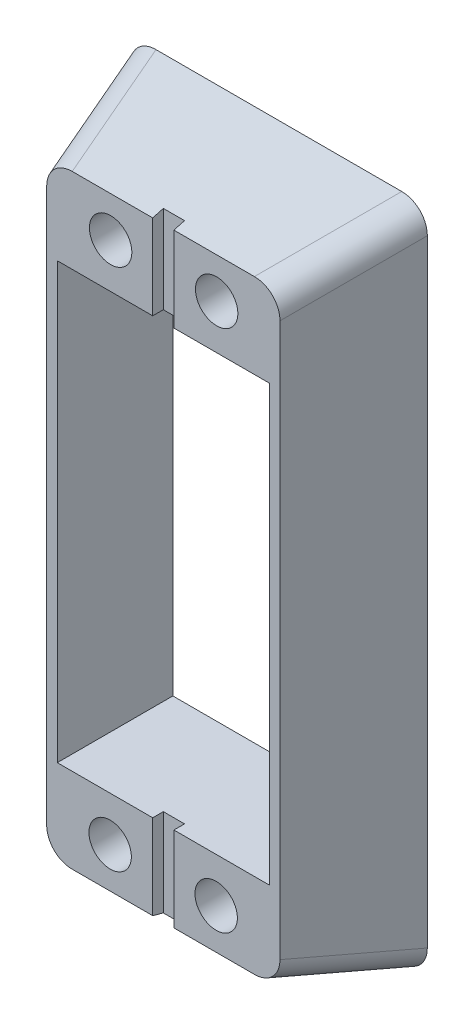
ISO-10303-21;
HEADER;
FILE_DESCRIPTION(('STEP AP214'),'2;1');
FILE_NAME('part.step','',(''),(''),'','','');
FILE_SCHEMA(('AUTOMOTIVE_DESIGN { 1 0 10303 214 1 1 1 1 }'));
ENDSEC;
DATA;
#1=APPLICATION_CONTEXT('core data for automotive mechanical design processes');
#2=APPLICATION_PROTOCOL_DEFINITION('international standard','automotive_design',2000,#1);
#3=PRODUCT_CONTEXT('',#1,'mechanical');
#4=PRODUCT('Part','Part','',(#3));
#5=PRODUCT_RELATED_PRODUCT_CATEGORY('part','',(#4));
#6=PRODUCT_DEFINITION_FORMATION('','',#4);
#7=PRODUCT_DEFINITION_CONTEXT('part definition',#1,'design');
#8=PRODUCT_DEFINITION('design','',#6,#7);
#9=PRODUCT_DEFINITION_SHAPE('','',#8);
#10=(LENGTH_UNIT() NAMED_UNIT(*) SI_UNIT(.MILLI.,.METRE.));
#11=(NAMED_UNIT(*) PLANE_ANGLE_UNIT() SI_UNIT($,.RADIAN.));
#12=(NAMED_UNIT(*) SI_UNIT($,.STERADIAN.) SOLID_ANGLE_UNIT());
#13=UNCERTAINTY_MEASURE_WITH_UNIT(LENGTH_MEASURE(1.E-05),#10,'distance_accuracy_value','');
#14=(GEOMETRIC_REPRESENTATION_CONTEXT(3) GLOBAL_UNCERTAINTY_ASSIGNED_CONTEXT((#13)) GLOBAL_UNIT_ASSIGNED_CONTEXT((#10,
#11,#12)) REPRESENTATION_CONTEXT('',''));
#15=CARTESIAN_POINT('',(0.,0.,0.));
#16=DIRECTION('',(0.,0.,1.));
#17=DIRECTION('',(1.,0.,0.));
#18=AXIS2_PLACEMENT_3D('',#15,#16,#17);
#19=CARTESIAN_POINT('',(0.,0.,10.9));
#20=DIRECTION('',(0.,0.,-1.));
#21=DIRECTION('',(-1.,0.,0.));
#22=AXIS2_PLACEMENT_3D('',#19,#20,#21);
#23=PLANE('',#22);
#24=CARTESIAN_POINT('',(-5.01324962082164,-14.95,10.9));
#25=DIRECTION('',(0.,0.,-1.));
#26=DIRECTION('',(-1.,0.,0.));
#27=AXIS2_PLACEMENT_3D('',#24,#25,#26);
#28=CIRCLE('',#27,2.);
#29=CARTESIAN_POINT('',(-7.01324962082164,-14.95,10.9));
#30=VERTEX_POINT('',#29);
#31=EDGE_CURVE('E247',#30,#30,#28,.T.);
#32=ORIENTED_EDGE('',*,*,#31,.T.);
#33=EDGE_LOOP('',(#32));
#34=FACE_BOUND('',#33,.T.);
#35=CARTESIAN_POINT('',(-4.96947475172855,34.45,10.9));
#36=DIRECTION('',(0.,0.,-1.));
#37=DIRECTION('',(-1.,0.,0.));
#38=AXIS2_PLACEMENT_3D('',#35,#36,#37);
#39=CIRCLE('',#38,2.);
#40=CARTESIAN_POINT('',(-6.96947475172855,34.45,10.9));
#41=VERTEX_POINT('',#40);
#42=EDGE_CURVE('E240',#41,#41,#39,.T.);
#43=ORIENTED_EDGE('',*,*,#42,.T.);
#44=EDGE_LOOP('',(#43));
#45=FACE_BOUND('',#44,.T.);
#46=DIRECTION('',(0.,-1.,0.));
#47=VECTOR('',#46,1.);
#48=CARTESIAN_POINT('',(-11.,0.,10.9));
#49=LINE('',#48,#47);
#50=CARTESIAN_POINT('',(-11.,35.8396279141903,10.9));
#51=VERTEX_POINT('',#50);
#52=CARTESIAN_POINT('',(-11.,-16.3396279141903,10.9));
#53=VERTEX_POINT('',#52);
#54=EDGE_CURVE('E320',#51,#53,#49,.T.);
#55=ORIENTED_EDGE('',*,*,#54,.T.);
#56=CARTESIAN_POINT('',(-8.4070393377044,-16.1570393377044,10.9));
#57=DIRECTION('',(0.,0.,-1.));
#58=DIRECTION('',(-0.707106781186548,-0.707106781186548,0.));
#59=AXIS2_PLACEMENT_3D('',#56,#57,#58);
#60=ELLIPSE('',#59,2.68270199471072,2.5);
#61=CARTESIAN_POINT('',(-8.58962791419027,-18.75,10.9));
#62=VERTEX_POINT('',#61);
#63=EDGE_CURVE('E184',#53,#62,#60,.F.);
#64=ORIENTED_EDGE('',*,*,#63,.T.);
#65=DIRECTION('',(1.,0.,0.));
#66=VECTOR('',#65,1.);
#67=CARTESIAN_POINT('',(0.,-18.75,10.9));
#68=LINE('',#67,#66);
#69=CARTESIAN_POINT('',(-1.,-18.75,10.9));
#70=VERTEX_POINT('',#69);
#71=EDGE_CURVE('E177',#62,#70,#68,.T.);
#72=ORIENTED_EDGE('',*,*,#71,.T.);
#73=DIRECTION('',(0.,1.,0.));
#74=VECTOR('',#73,1.);
#75=CARTESIAN_POINT('',(-1.,-21.75,10.9));
#76=LINE('',#75,#74);
#77=CARTESIAN_POINT('',(-1.,-10.75,10.9));
#78=VERTEX_POINT('',#77);
#79=EDGE_CURVE('E181',#70,#78,#76,.T.);
#80=ORIENTED_EDGE('',*,*,#79,.T.);
#81=DIRECTION('',(1.,0.,0.));
#82=VECTOR('',#81,1.);
#83=CARTESIAN_POINT('',(-9.99999999999998,-10.75,10.9));
#84=LINE('',#83,#82);
#85=CARTESIAN_POINT('',(-9.99999999999998,-10.75,10.9));
#86=VERTEX_POINT('',#85);
#87=EDGE_CURVE('E269',#86,#78,#84,.T.);
#88=ORIENTED_EDGE('',*,*,#87,.F.);
#89=DIRECTION('',(0.,-1.,0.));
#90=VECTOR('',#89,1.);
#91=CARTESIAN_POINT('',(-9.99999999999998,-10.75,10.9));
#92=LINE('',#91,#90);
#93=CARTESIAN_POINT('',(-9.99999999999998,30.25,10.9));
#94=VERTEX_POINT('',#93);
#95=EDGE_CURVE('E264',#94,#86,#92,.T.);
#96=ORIENTED_EDGE('',*,*,#95,.F.);
#97=DIRECTION('',(-1.,0.,0.));
#98=VECTOR('',#97,1.);
#99=CARTESIAN_POINT('',(-9.99999999999998,30.25,10.9));
#100=LINE('',#99,#98);
#101=CARTESIAN_POINT('',(-1.,30.25,10.9));
#102=VERTEX_POINT('',#101);
#103=EDGE_CURVE('E258',#102,#94,#100,.T.);
#104=ORIENTED_EDGE('',*,*,#103,.F.);
#105=CARTESIAN_POINT('',(-1.,38.25,10.9));
#106=VERTEX_POINT('',#105);
#107=EDGE_CURVE('E202',#102,#106,#76,.T.);
#108=ORIENTED_EDGE('',*,*,#107,.T.);
#109=DIRECTION('',(-1.,0.,0.));
#110=VECTOR('',#109,1.);
#111=CARTESIAN_POINT('',(0.,38.25,10.9));
#112=LINE('',#111,#110);
#113=CARTESIAN_POINT('',(-8.58962791419027,38.25,10.9));
#114=VERTEX_POINT('',#113);
#115=EDGE_CURVE('E316',#106,#114,#112,.T.);
#116=ORIENTED_EDGE('',*,*,#115,.T.);
#117=CARTESIAN_POINT('',(-8.4070393377044,35.6570393377044,10.9));
#118=DIRECTION('',(0.,0.,-1.));
#119=DIRECTION('',(0.707106781186548,-0.707106781186548,0.));
#120=AXIS2_PLACEMENT_3D('',#117,#118,#119);
#121=ELLIPSE('',#120,2.68270199471072,2.5);
#122=EDGE_CURVE('E358',#114,#51,#121,.F.);
#123=ORIENTED_EDGE('',*,*,#122,.T.);
#124=EDGE_LOOP('',(#55,#64,#72,#80,#88,#96,#104,#108,#116,#123));
#125=FACE_BOUND('',#124,.T.);
#126=ADVANCED_FACE('F39',(#34,#45,#125),#23,.F.);
#127=CARTESIAN_POINT('',(5.03052524827147,34.45,10.9));
#128=DIRECTION('',(0.,0.,-1.));
#129=DIRECTION('',(-1.,0.,0.));
#130=AXIS2_PLACEMENT_3D('',#127,#128,#129);
#131=CIRCLE('',#130,2.);
#132=CARTESIAN_POINT('',(3.03052524827147,34.45,10.9));
#133=VERTEX_POINT('',#132);
#134=EDGE_CURVE('E232',#133,#133,#131,.T.);
#135=ORIENTED_EDGE('',*,*,#134,.T.);
#136=EDGE_LOOP('',(#135));
#137=FACE_BOUND('',#136,.T.);
#138=CARTESIAN_POINT('',(4.98675037917836,-14.95,10.9));
#139=DIRECTION('',(0.,0.,-1.));
#140=DIRECTION('',(-1.,0.,0.));
#141=AXIS2_PLACEMENT_3D('',#138,#139,#140);
#142=CIRCLE('',#141,2.);
#143=CARTESIAN_POINT('',(2.98675037917836,-14.95,10.9));
#144=VERTEX_POINT('',#143);
#145=EDGE_CURVE('E223',#144,#144,#142,.T.);
#146=ORIENTED_EDGE('',*,*,#145,.T.);
#147=EDGE_LOOP('',(#146));
#148=FACE_BOUND('',#147,.T.);
#149=CARTESIAN_POINT('',(1.,-18.75,10.9));
#150=VERTEX_POINT('',#149);
#151=CARTESIAN_POINT('',(8.58962791419028,-18.75,10.9));
#152=VERTEX_POINT('',#151);
#153=EDGE_CURVE('E191',#150,#152,#68,.T.);
#154=ORIENTED_EDGE('',*,*,#153,.T.);
#155=CARTESIAN_POINT('',(8.4070393377044,-16.1570393377044,10.9));
#156=DIRECTION('',(0.,0.,-1.));
#157=DIRECTION('',(0.707106781186548,-0.707106781186548,0.));
#158=AXIS2_PLACEMENT_3D('',#155,#156,#157);
#159=ELLIPSE('',#158,2.68270199471072,2.5);
#160=CARTESIAN_POINT('',(11.,-16.3396279141903,10.9));
#161=VERTEX_POINT('',#160);
#162=EDGE_CURVE('E372',#152,#161,#159,.F.);
#163=ORIENTED_EDGE('',*,*,#162,.T.);
#164=DIRECTION('',(0.,1.,0.));
#165=VECTOR('',#164,1.);
#166=CARTESIAN_POINT('',(11.,0.,10.9));
#167=LINE('',#166,#165);
#168=CARTESIAN_POINT('',(11.,35.8396279141903,10.9));
#169=VERTEX_POINT('',#168);
#170=EDGE_CURVE('E190',#161,#169,#167,.T.);
#171=ORIENTED_EDGE('',*,*,#170,.T.);
#172=CARTESIAN_POINT('',(8.4070393377044,35.6570393377044,10.9));
#173=DIRECTION('',(0.,0.,-1.));
#174=DIRECTION('',(-0.707106781186548,-0.707106781186548,0.));
#175=AXIS2_PLACEMENT_3D('',#172,#173,#174);
#176=ELLIPSE('',#175,2.68270199471072,2.5);
#177=CARTESIAN_POINT('',(8.58962791419028,38.25,10.9));
#178=VERTEX_POINT('',#177);
#179=EDGE_CURVE('E55',#169,#178,#176,.F.);
#180=ORIENTED_EDGE('',*,*,#179,.T.);
#181=CARTESIAN_POINT('',(1.,38.25,10.9));
#182=VERTEX_POINT('',#181);
#183=EDGE_CURVE('E317',#178,#182,#112,.T.);
#184=ORIENTED_EDGE('',*,*,#183,.T.);
#185=DIRECTION('',(0.,1.,0.));
#186=VECTOR('',#185,1.);
#187=CARTESIAN_POINT('',(1.,-21.75,10.9));
#188=LINE('',#187,#186);
#189=CARTESIAN_POINT('',(1.,30.25,10.9));
#190=VERTEX_POINT('',#189);
#191=EDGE_CURVE('E201',#190,#182,#188,.T.);
#192=ORIENTED_EDGE('',*,*,#191,.F.);
#193=CARTESIAN_POINT('',(10.,30.25,10.9));
#194=VERTEX_POINT('',#193);
#195=EDGE_CURVE('E260',#194,#190,#100,.T.);
#196=ORIENTED_EDGE('',*,*,#195,.F.);
#197=DIRECTION('',(0.,1.,0.));
#198=VECTOR('',#197,1.);
#199=CARTESIAN_POINT('',(10.,-10.75,10.9));
#200=LINE('',#199,#198);
#201=CARTESIAN_POINT('',(10.,-10.75,10.9));
#202=VERTEX_POINT('',#201);
#203=EDGE_CURVE('E255',#202,#194,#200,.T.);
#204=ORIENTED_EDGE('',*,*,#203,.F.);
#205=CARTESIAN_POINT('',(1.,-10.75,10.9));
#206=VERTEX_POINT('',#205);
#207=EDGE_CURVE('E268',#206,#202,#84,.T.);
#208=ORIENTED_EDGE('',*,*,#207,.F.);
#209=EDGE_CURVE('E470',#150,#206,#188,.T.);
#210=ORIENTED_EDGE('',*,*,#209,.F.);
#211=EDGE_LOOP('',(#154,#163,#171,#180,#184,#192,#196,#204,#208,#210));
#212=FACE_BOUND('',#211,.T.);
#213=ADVANCED_FACE('F393',(#137,#148,#212),#23,.F.);
#214=CARTESIAN_POINT('',(0.,0.,0.));
#215=DIRECTION('',(0.,0.,-1.));
#216=DIRECTION('',(-1.,0.,0.));
#217=AXIS2_PLACEMENT_3D('',#214,#215,#216);
#218=PLANE('',#217);
#219=CARTESIAN_POINT('',(-4.96947475172855,34.45,0.));
#220=DIRECTION('',(0.,0.,-1.));
#221=DIRECTION('',(-1.,0.,0.));
#222=AXIS2_PLACEMENT_3D('',#219,#220,#221);
#223=CIRCLE('',#222,2.);
#224=CARTESIAN_POINT('',(-6.96947475172855,34.45,0.));
#225=VERTEX_POINT('',#224);
#226=EDGE_CURVE('E222',#225,#225,#223,.T.);
#227=ORIENTED_EDGE('',*,*,#226,.F.);
#228=EDGE_LOOP('',(#227));
#229=FACE_BOUND('',#228,.T.);
#230=CARTESIAN_POINT('',(5.03052524827147,34.45,0.));
#231=DIRECTION('',(0.,0.,-1.));
#232=DIRECTION('',(-1.,0.,0.));
#233=AXIS2_PLACEMENT_3D('',#230,#231,#232);
#234=CIRCLE('',#233,2.);
#235=CARTESIAN_POINT('',(3.03052524827147,34.45,0.));
#236=VERTEX_POINT('',#235);
#237=EDGE_CURVE('E236',#236,#236,#234,.T.);
#238=ORIENTED_EDGE('',*,*,#237,.F.);
#239=EDGE_LOOP('',(#238));
#240=FACE_BOUND('',#239,.T.);
#241=CARTESIAN_POINT('',(4.98675037917836,-14.95,0.));
#242=DIRECTION('',(0.,0.,-1.));
#243=DIRECTION('',(-1.,0.,0.));
#244=AXIS2_PLACEMENT_3D('',#241,#242,#243);
#245=CIRCLE('',#244,2.);
#246=CARTESIAN_POINT('',(2.98675037917836,-14.95,0.));
#247=VERTEX_POINT('',#246);
#248=EDGE_CURVE('E228',#247,#247,#245,.T.);
#249=ORIENTED_EDGE('',*,*,#248,.F.);
#250=EDGE_LOOP('',(#249));
#251=FACE_BOUND('',#250,.T.);
#252=CARTESIAN_POINT('',(-5.01324962082164,-14.95,0.));
#253=DIRECTION('',(0.,0.,-1.));
#254=DIRECTION('',(-1.,0.,0.));
#255=AXIS2_PLACEMENT_3D('',#252,#253,#254);
#256=CIRCLE('',#255,2.);
#257=CARTESIAN_POINT('',(-7.01324962082164,-14.95,0.));
#258=VERTEX_POINT('',#257);
#259=EDGE_CURVE('E227',#258,#258,#256,.T.);
#260=ORIENTED_EDGE('',*,*,#259,.F.);
#261=EDGE_LOOP('',(#260));
#262=FACE_BOUND('',#261,.T.);
#263=DIRECTION('',(1.,0.,0.));
#264=VECTOR('',#263,1.);
#265=CARTESIAN_POINT('',(-14.,-21.75,0.));
#266=LINE('',#265,#264);
#267=CARTESIAN_POINT('',(-11.5896279141902,-21.75,0.));
#268=VERTEX_POINT('',#267);
#269=CARTESIAN_POINT('',(11.5896279141902,-21.75,0.));
#270=VERTEX_POINT('',#269);
#271=EDGE_CURVE('E312',#268,#270,#266,.T.);
#272=ORIENTED_EDGE('',*,*,#271,.F.);
#273=CARTESIAN_POINT('',(-11.4070393377044,-19.1570393377044,0.));
#274=DIRECTION('',(0.,0.,-1.));
#275=DIRECTION('',(-0.707106781186548,-0.707106781186548,0.));
#276=AXIS2_PLACEMENT_3D('',#273,#274,#275);
#277=ELLIPSE('',#276,2.68270199471072,2.5);
#278=CARTESIAN_POINT('',(-14.,-19.3396279141902,0.));
#279=VERTEX_POINT('',#278);
#280=EDGE_CURVE('E349',#268,#279,#277,.T.);
#281=ORIENTED_EDGE('',*,*,#280,.T.);
#282=DIRECTION('',(0.,-1.,0.));
#283=VECTOR('',#282,1.);
#284=CARTESIAN_POINT('',(-14.,-21.75,0.));
#285=LINE('',#284,#283);
#286=CARTESIAN_POINT('',(-14.,38.8396279141902,0.));
#287=VERTEX_POINT('',#286);
#288=EDGE_CURVE('E308',#287,#279,#285,.T.);
#289=ORIENTED_EDGE('',*,*,#288,.F.);
#290=CARTESIAN_POINT('',(-11.4070393377044,38.6570393377044,0.));
#291=DIRECTION('',(0.,0.,-1.));
#292=DIRECTION('',(0.707106781186548,-0.707106781186548,0.));
#293=AXIS2_PLACEMENT_3D('',#290,#291,#292);
#294=ELLIPSE('',#293,2.68270199471072,2.5);
#295=CARTESIAN_POINT('',(-11.5896279141902,41.25,0.));
#296=VERTEX_POINT('',#295);
#297=EDGE_CURVE('E343',#287,#296,#294,.T.);
#298=ORIENTED_EDGE('',*,*,#297,.T.);
#299=DIRECTION('',(-1.,0.,0.));
#300=VECTOR('',#299,1.);
#301=CARTESIAN_POINT('',(-14.,41.25,0.));
#302=LINE('',#301,#300);
#303=CARTESIAN_POINT('',(11.5896279141902,41.25,0.));
#304=VERTEX_POINT('',#303);
#305=EDGE_CURVE('E304',#304,#296,#302,.T.);
#306=ORIENTED_EDGE('',*,*,#305,.F.);
#307=CARTESIAN_POINT('',(11.4070393377044,38.6570393377044,0.));
#308=DIRECTION('',(0.,0.,-1.));
#309=DIRECTION('',(-0.707106781186548,-0.707106781186548,0.));
#310=AXIS2_PLACEMENT_3D('',#307,#308,#309);
#311=ELLIPSE('',#310,2.68270199471072,2.5);
#312=CARTESIAN_POINT('',(14.,38.8396279141902,0.));
#313=VERTEX_POINT('',#312);
#314=EDGE_CURVE('E340',#304,#313,#311,.T.);
#315=ORIENTED_EDGE('',*,*,#314,.T.);
#316=DIRECTION('',(0.,1.,0.));
#317=VECTOR('',#316,1.);
#318=CARTESIAN_POINT('',(14.,-21.75,0.));
#319=LINE('',#318,#317);
#320=CARTESIAN_POINT('',(14.,-19.3396279141902,0.));
#321=VERTEX_POINT('',#320);
#322=EDGE_CURVE('E300',#321,#313,#319,.T.);
#323=ORIENTED_EDGE('',*,*,#322,.F.);
#324=CARTESIAN_POINT('',(11.4070393377044,-19.1570393377044,0.));
#325=DIRECTION('',(0.,0.,-1.));
#326=DIRECTION('',(0.707106781186548,-0.707106781186548,0.));
#327=AXIS2_PLACEMENT_3D('',#324,#325,#326);
#328=ELLIPSE('',#327,2.68270199471072,2.5);
#329=EDGE_CURVE('E346',#321,#270,#328,.T.);
#330=ORIENTED_EDGE('',*,*,#329,.T.);
#331=EDGE_LOOP('',(#272,#281,#289,#298,#306,#315,#323,#330));
#332=FACE_BOUND('',#331,.T.);
#333=DIRECTION('',(1.,0.,0.));
#334=VECTOR('',#333,1.);
#335=CARTESIAN_POINT('',(-9.99999999999998,-10.75,0.));
#336=LINE('',#335,#334);
#337=CARTESIAN_POINT('',(-9.99999999999998,-10.75,0.));
#338=VERTEX_POINT('',#337);
#339=CARTESIAN_POINT('',(10.,-10.75,0.));
#340=VERTEX_POINT('',#339);
#341=EDGE_CURVE('E259',#338,#340,#336,.T.);
#342=ORIENTED_EDGE('',*,*,#341,.T.);
#343=DIRECTION('',(0.,1.,0.));
#344=VECTOR('',#343,1.);
#345=CARTESIAN_POINT('',(10.,-10.75,0.));
#346=LINE('',#345,#344);
#347=CARTESIAN_POINT('',(10.,30.25,0.));
#348=VERTEX_POINT('',#347);
#349=EDGE_CURVE('E251',#340,#348,#346,.T.);
#350=ORIENTED_EDGE('',*,*,#349,.T.);
#351=DIRECTION('',(-1.,0.,0.));
#352=VECTOR('',#351,1.);
#353=CARTESIAN_POINT('',(-9.99999999999998,30.25,0.));
#354=LINE('',#353,#352);
#355=CARTESIAN_POINT('',(-9.99999999999998,30.25,0.));
#356=VERTEX_POINT('',#355);
#357=EDGE_CURVE('E276',#348,#356,#354,.T.);
#358=ORIENTED_EDGE('',*,*,#357,.T.);
#359=DIRECTION('',(0.,-1.,0.));
#360=VECTOR('',#359,1.);
#361=CARTESIAN_POINT('',(-9.99999999999998,-10.75,0.));
#362=LINE('',#361,#360);
#363=EDGE_CURVE('E280',#356,#338,#362,.T.);
#364=ORIENTED_EDGE('',*,*,#363,.T.);
#365=EDGE_LOOP('',(#342,#350,#358,#364));
#366=FACE_BOUND('',#365,.T.);
#367=ADVANCED_FACE('F383',(#229,#240,#251,#262,#332,#366),#218,.T.);
#368=CARTESIAN_POINT('',(10.,-10.75,10.9));
#369=DIRECTION('',(-1.,0.,0.));
#370=DIRECTION('',(0.,0.,1.));
#371=AXIS2_PLACEMENT_3D('',#368,#369,#370);
#372=PLANE('',#371);
#373=ORIENTED_EDGE('',*,*,#349,.F.);
#374=DIRECTION('',(0.,0.,-1.));
#375=VECTOR('',#374,1.);
#376=CARTESIAN_POINT('',(10.,-10.75,10.9));
#377=LINE('',#376,#375);
#378=EDGE_CURVE('E272',#202,#340,#377,.T.);
#379=ORIENTED_EDGE('',*,*,#378,.F.);
#380=ORIENTED_EDGE('',*,*,#203,.T.);
#381=DIRECTION('',(0.,0.,-1.));
#382=VECTOR('',#381,1.);
#383=CARTESIAN_POINT('',(10.,30.25,10.9));
#384=LINE('',#383,#382);
#385=EDGE_CURVE('E296',#194,#348,#384,.T.);
#386=ORIENTED_EDGE('',*,*,#385,.T.);
#387=EDGE_LOOP('',(#373,#379,#380,#386));
#388=FACE_BOUND('',#387,.T.);
#389=ADVANCED_FACE('F434',(#388),#372,.T.);
#390=CARTESIAN_POINT('',(-9.99999999999998,30.25,10.9));
#391=DIRECTION('',(0.,-1.,0.));
#392=DIRECTION('',(0.,0.,-1.));
#393=AXIS2_PLACEMENT_3D('',#390,#391,#392);
#394=PLANE('',#393);
#395=DIRECTION('',(0.,0.,-1.));
#396=VECTOR('',#395,1.);
#397=CARTESIAN_POINT('',(-1.,30.25,10.9));
#398=LINE('',#397,#396);
#399=CARTESIAN_POINT('',(-1.,30.25,9.9));
#400=VERTEX_POINT('',#399);
#401=EDGE_CURVE('E214',#102,#400,#398,.T.);
#402=ORIENTED_EDGE('',*,*,#401,.F.);
#403=ORIENTED_EDGE('',*,*,#103,.T.);
#404=DIRECTION('',(0.,0.,-1.));
#405=VECTOR('',#404,1.);
#406=CARTESIAN_POINT('',(-9.99999999999998,30.25,10.9));
#407=LINE('',#406,#405);
#408=EDGE_CURVE('E293',#94,#356,#407,.T.);
#409=ORIENTED_EDGE('',*,*,#408,.T.);
#410=ORIENTED_EDGE('',*,*,#357,.F.);
#411=ORIENTED_EDGE('',*,*,#385,.F.);
#412=ORIENTED_EDGE('',*,*,#195,.T.);
#413=DIRECTION('',(0.,0.,1.));
#414=VECTOR('',#413,1.);
#415=CARTESIAN_POINT('',(1.,30.25,10.9));
#416=LINE('',#415,#414);
#417=CARTESIAN_POINT('',(1.,30.25,9.9));
#418=VERTEX_POINT('',#417);
#419=EDGE_CURVE('E440',#418,#190,#416,.T.);
#420=ORIENTED_EDGE('',*,*,#419,.F.);
#421=DIRECTION('',(1.,0.,0.));
#422=VECTOR('',#421,1.);
#423=CARTESIAN_POINT('',(-9.99999999999998,30.25,9.9));
#424=LINE('',#423,#422);
#425=EDGE_CURVE('E210',#400,#418,#424,.T.);
#426=ORIENTED_EDGE('',*,*,#425,.F.);
#427=EDGE_LOOP('',(#402,#403,#409,#410,#411,#412,#420,#426));
#428=FACE_BOUND('',#427,.T.);
#429=ADVANCED_FACE('F420',(#428),#394,.T.);
#430=CARTESIAN_POINT('',(-9.99999999999998,-10.75,10.9));
#431=DIRECTION('',(1.,0.,0.));
#432=DIRECTION('',(0.,0.,-1.));
#433=AXIS2_PLACEMENT_3D('',#430,#431,#432);
#434=PLANE('',#433);
#435=ORIENTED_EDGE('',*,*,#363,.F.);
#436=ORIENTED_EDGE('',*,*,#408,.F.);
#437=ORIENTED_EDGE('',*,*,#95,.T.);
#438=DIRECTION('',(0.,0.,-1.));
#439=VECTOR('',#438,1.);
#440=CARTESIAN_POINT('',(-9.99999999999998,-10.75,10.9));
#441=LINE('',#440,#439);
#442=EDGE_CURVE('E290',#86,#338,#441,.T.);
#443=ORIENTED_EDGE('',*,*,#442,.T.);
#444=EDGE_LOOP('',(#435,#436,#437,#443));
#445=FACE_BOUND('',#444,.T.);
#446=ADVANCED_FACE('F425',(#445),#434,.T.);
#447=CARTESIAN_POINT('',(-9.99999999999998,-10.75,10.9));
#448=DIRECTION('',(0.,1.,0.));
#449=DIRECTION('',(0.,0.,1.));
#450=AXIS2_PLACEMENT_3D('',#447,#448,#449);
#451=PLANE('',#450);
#452=DIRECTION('',(0.,0.,1.));
#453=VECTOR('',#452,1.);
#454=CARTESIAN_POINT('',(-1.,-10.75,10.9));
#455=LINE('',#454,#453);
#456=CARTESIAN_POINT('',(-1.,-10.75,9.9));
#457=VERTEX_POINT('',#456);
#458=EDGE_CURVE('E199',#457,#78,#455,.T.);
#459=ORIENTED_EDGE('',*,*,#458,.F.);
#460=DIRECTION('',(-1.,0.,0.));
#461=VECTOR('',#460,1.);
#462=CARTESIAN_POINT('',(-9.99999999999998,-10.75,9.9));
#463=LINE('',#462,#461);
#464=CARTESIAN_POINT('',(1.,-10.75,9.9));
#465=VERTEX_POINT('',#464);
#466=EDGE_CURVE('E216',#465,#457,#463,.T.);
#467=ORIENTED_EDGE('',*,*,#466,.F.);
#468=DIRECTION('',(0.,0.,-1.));
#469=VECTOR('',#468,1.);
#470=CARTESIAN_POINT('',(1.,-10.75,10.9));
#471=LINE('',#470,#469);
#472=EDGE_CURVE('E444',#206,#465,#471,.T.);
#473=ORIENTED_EDGE('',*,*,#472,.F.);
#474=ORIENTED_EDGE('',*,*,#207,.T.);
#475=ORIENTED_EDGE('',*,*,#378,.T.);
#476=ORIENTED_EDGE('',*,*,#341,.F.);
#477=ORIENTED_EDGE('',*,*,#442,.F.);
#478=ORIENTED_EDGE('',*,*,#87,.T.);
#479=EDGE_LOOP('',(#459,#467,#473,#474,#475,#476,#477,#478));
#480=FACE_BOUND('',#479,.T.);
#481=ADVANCED_FACE('F427',(#480),#451,.T.);
#482=CARTESIAN_POINT('',(-5.01324962082164,-14.95,10.9));
#483=DIRECTION('',(0.,0.,-1.));
#484=DIRECTION('',(-1.,0.,0.));
#485=AXIS2_PLACEMENT_3D('',#482,#483,#484);
#486=CYLINDRICAL_SURFACE('',#485,2.);
#487=ORIENTED_EDGE('',*,*,#31,.F.);
#488=EDGE_LOOP('',(#487));
#489=FACE_BOUND('',#488,.T.);
#490=ORIENTED_EDGE('',*,*,#259,.T.);
#491=EDGE_LOOP('',(#490));
#492=FACE_BOUND('',#491,.T.);
#493=ADVANCED_FACE('F629',(#489,#492),#486,.F.);
#494=CARTESIAN_POINT('',(4.98675037917836,-14.95,10.9));
#495=DIRECTION('',(0.,0.,-1.));
#496=DIRECTION('',(-1.,0.,0.));
#497=AXIS2_PLACEMENT_3D('',#494,#495,#496);
#498=CYLINDRICAL_SURFACE('',#497,2.);
#499=ORIENTED_EDGE('',*,*,#145,.F.);
#500=EDGE_LOOP('',(#499));
#501=FACE_BOUND('',#500,.T.);
#502=ORIENTED_EDGE('',*,*,#248,.T.);
#503=EDGE_LOOP('',(#502));
#504=FACE_BOUND('',#503,.T.);
#505=ADVANCED_FACE('F657',(#501,#504),#498,.F.);
#506=CARTESIAN_POINT('',(5.03052524827147,34.45,10.9));
#507=DIRECTION('',(0.,0.,-1.));
#508=DIRECTION('',(-1.,0.,0.));
#509=AXIS2_PLACEMENT_3D('',#506,#507,#508);
#510=CYLINDRICAL_SURFACE('',#509,2.);
#511=ORIENTED_EDGE('',*,*,#134,.F.);
#512=EDGE_LOOP('',(#511));
#513=FACE_BOUND('',#512,.T.);
#514=ORIENTED_EDGE('',*,*,#237,.T.);
#515=EDGE_LOOP('',(#514));
#516=FACE_BOUND('',#515,.T.);
#517=ADVANCED_FACE('F647',(#513,#516),#510,.F.);
#518=CARTESIAN_POINT('',(-4.96947475172855,34.45,10.9));
#519=DIRECTION('',(0.,0.,-1.));
#520=DIRECTION('',(-1.,0.,0.));
#521=AXIS2_PLACEMENT_3D('',#518,#519,#520);
#522=CYLINDRICAL_SURFACE('',#521,2.);
#523=ORIENTED_EDGE('',*,*,#42,.F.);
#524=EDGE_LOOP('',(#523));
#525=FACE_BOUND('',#524,.T.);
#526=ORIENTED_EDGE('',*,*,#226,.T.);
#527=EDGE_LOOP('',(#526));
#528=FACE_BOUND('',#527,.T.);
#529=ADVANCED_FACE('F511',(#525,#528),#522,.F.);
#530=CARTESIAN_POINT('',(-11.,0.,10.9));
#531=DIRECTION('',(0.964148834323889,0.,-0.265362064492811));
#532=DIRECTION('',(0.,-1.,0.));
#533=AXIS2_PLACEMENT_3D('',#530,#531,#532);
#534=PLANE('',#533);
#535=ORIENTED_EDGE('',*,*,#288,.T.);
#536=DIRECTION('',(0.256485213733031,0.256485213733031,0.931896276563354));
#537=VECTOR('',#536,1.);
#538=CARTESIAN_POINT('',(-9.92510305366778,-15.2647309678581,14.8054589050071));
#539=LINE('',#538,#537);
#540=EDGE_CURVE('E355',#279,#53,#539,.T.);
#541=ORIENTED_EDGE('',*,*,#540,.T.);
#542=ORIENTED_EDGE('',*,*,#54,.F.);
#543=DIRECTION('',(-0.256485213733031,0.256485213733031,-0.931896276563354));
#544=VECTOR('',#543,1.);
#545=CARTESIAN_POINT('',(-8.64230208882605,33.4819300030163,19.4663024105987));
#546=LINE('',#545,#544);
#547=EDGE_CURVE('E352',#51,#287,#546,.T.);
#548=ORIENTED_EDGE('',*,*,#547,.T.);
#549=EDGE_LOOP('',(#535,#541,#542,#548));
#550=FACE_BOUND('',#549,.T.);
#551=ADVANCED_FACE('F404',(#550),#534,.F.);
#552=CARTESIAN_POINT('',(0.,-18.75,10.9));
#553=DIRECTION('',(0.,0.964148834323889,-0.265362064492811));
#554=DIRECTION('',(1.,0.,0.));
#555=AXIS2_PLACEMENT_3D('',#552,#553,#554);
#556=PLANE('',#555);
#557=ORIENTED_EDGE('',*,*,#71,.F.);
#558=DIRECTION('',(0.256485213733031,0.256485213733031,0.931896276563354));
#559=VECTOR('',#558,1.);
#560=CARTESIAN_POINT('',(-8.02456212055157,-18.1849342063613,12.953072383554));
#561=LINE('',#560,#559);
#562=EDGE_CURVE('E337',#62,#268,#561,.F.);
#563=ORIENTED_EDGE('',*,*,#562,.T.);
#564=ORIENTED_EDGE('',*,*,#271,.T.);
#565=DIRECTION('',(-0.256485213733031,0.256485213733031,0.931896276563354));
#566=VECTOR('',#565,1.);
#567=CARTESIAN_POINT('',(8.02456212055157,-18.1849342063613,12.953072383554));
#568=LINE('',#567,#566);
#569=EDGE_CURVE('E334',#270,#152,#568,.T.);
#570=ORIENTED_EDGE('',*,*,#569,.T.);
#571=ORIENTED_EDGE('',*,*,#153,.F.);
#572=DIRECTION('',(0.,-0.265362064492811,-0.964148834323889));
#573=VECTOR('',#572,1.);
#574=CARTESIAN_POINT('',(1.,-18.75,10.9));
#575=LINE('',#574,#573);
#576=CARTESIAN_POINT('',(1.,-19.0252293577982,9.9));
#577=VERTEX_POINT('',#576);
#578=EDGE_CURVE('E449',#577,#150,#575,.F.);
#579=ORIENTED_EDGE('',*,*,#578,.F.);
#580=DIRECTION('',(-1.,0.,0.));
#581=VECTOR('',#580,1.);
#582=CARTESIAN_POINT('',(0.,-19.0252293577982,9.9));
#583=LINE('',#582,#581);
#584=CARTESIAN_POINT('',(-1.,-19.0252293577982,9.9));
#585=VERTEX_POINT('',#584);
#586=EDGE_CURVE('E208',#585,#577,#583,.F.);
#587=ORIENTED_EDGE('',*,*,#586,.F.);
#588=DIRECTION('',(0.,0.265362064492811,0.964148834323889));
#589=VECTOR('',#588,1.);
#590=CARTESIAN_POINT('',(-1.,-18.75,10.9));
#591=LINE('',#590,#589);
#592=EDGE_CURVE('E196',#70,#585,#591,.F.);
#593=ORIENTED_EDGE('',*,*,#592,.F.);
#594=EDGE_LOOP('',(#557,#563,#564,#570,#571,#579,#587,#593));
#595=FACE_BOUND('',#594,.T.);
#596=ADVANCED_FACE('F205',(#595),#556,.F.);
#597=CARTESIAN_POINT('',(0.,38.25,10.9));
#598=DIRECTION('',(0.,-0.964148834323889,-0.265362064492811));
#599=DIRECTION('',(-1.,0.,0.));
#600=AXIS2_PLACEMENT_3D('',#597,#598,#599);
#601=PLANE('',#600);
#602=ORIENTED_EDGE('',*,*,#305,.T.);
#603=DIRECTION('',(-0.256485213733031,0.256485213733031,-0.931896276563354));
#604=VECTOR('',#603,1.);
#605=CARTESIAN_POINT('',(-8.02456212055157,37.6849342063613,12.953072383554));
#606=LINE('',#605,#604);
#607=EDGE_CURVE('E11',#296,#114,#606,.F.);
#608=ORIENTED_EDGE('',*,*,#607,.T.);
#609=ORIENTED_EDGE('',*,*,#115,.F.);
#610=DIRECTION('',(0.,0.265362064492811,-0.964148834323889));
#611=VECTOR('',#610,1.);
#612=CARTESIAN_POINT('',(-1.,38.25,10.9));
#613=LINE('',#612,#611);
#614=CARTESIAN_POINT('',(-1.,38.5252293577982,9.9));
#615=VERTEX_POINT('',#614);
#616=EDGE_CURVE('E331',#615,#106,#613,.F.);
#617=ORIENTED_EDGE('',*,*,#616,.F.);
#618=DIRECTION('',(1.,0.,0.));
#619=VECTOR('',#618,1.);
#620=CARTESIAN_POINT('',(0.,38.5252293577982,9.9));
#621=LINE('',#620,#619);
#622=CARTESIAN_POINT('',(1.,38.5252293577981,9.9));
#623=VERTEX_POINT('',#622);
#624=EDGE_CURVE('E328',#623,#615,#621,.F.);
#625=ORIENTED_EDGE('',*,*,#624,.F.);
#626=DIRECTION('',(0.,-0.265362064492811,0.964148834323889));
#627=VECTOR('',#626,1.);
#628=CARTESIAN_POINT('',(1.,38.25,10.9));
#629=LINE('',#628,#627);
#630=EDGE_CURVE('E325',#182,#623,#629,.F.);
#631=ORIENTED_EDGE('',*,*,#630,.F.);
#632=ORIENTED_EDGE('',*,*,#183,.F.);
#633=DIRECTION('',(0.256485213733031,0.256485213733031,-0.931896276563354));
#634=VECTOR('',#633,1.);
#635=CARTESIAN_POINT('',(8.02456212055157,37.6849342063613,12.953072383554));
#636=LINE('',#635,#634);
#637=EDGE_CURVE('E48',#178,#304,#636,.T.);
#638=ORIENTED_EDGE('',*,*,#637,.T.);
#639=EDGE_LOOP('',(#602,#608,#609,#617,#625,#631,#632,#638));
#640=FACE_BOUND('',#639,.T.);
#641=ADVANCED_FACE('F377',(#640),#601,.F.);
#642=CARTESIAN_POINT('',(11.,0.,10.9));
#643=DIRECTION('',(-0.964148834323889,0.,-0.265362064492811));
#644=DIRECTION('',(0.,1.,0.));
#645=AXIS2_PLACEMENT_3D('',#642,#643,#644);
#646=PLANE('',#645);
#647=ORIENTED_EDGE('',*,*,#170,.F.);
#648=DIRECTION('',(-0.256485213733031,0.256485213733031,0.931896276563354));
#649=VECTOR('',#648,1.);
#650=CARTESIAN_POINT('',(9.92510305366779,-15.2647309678581,14.8054589050071));
#651=LINE('',#650,#649);
#652=EDGE_CURVE('E366',#161,#321,#651,.F.);
#653=ORIENTED_EDGE('',*,*,#652,.T.);
#654=ORIENTED_EDGE('',*,*,#322,.T.);
#655=DIRECTION('',(0.256485213733031,0.256485213733031,-0.931896276563354));
#656=VECTOR('',#655,1.);
#657=CARTESIAN_POINT('',(8.64230208882606,33.4819300030163,19.4663024105987));
#658=LINE('',#657,#656);
#659=EDGE_CURVE('E363',#313,#169,#658,.F.);
#660=ORIENTED_EDGE('',*,*,#659,.T.);
#661=EDGE_LOOP('',(#647,#653,#654,#660));
#662=FACE_BOUND('',#661,.T.);
#663=ADVANCED_FACE('F390',(#662),#646,.F.);
#664=CARTESIAN_POINT('',(1.,-21.75,10.9));
#665=DIRECTION('',(1.,0.,0.));
#666=DIRECTION('',(0.,0.,-1.));
#667=AXIS2_PLACEMENT_3D('',#664,#665,#666);
#668=PLANE('',#667);
#669=ORIENTED_EDGE('',*,*,#419,.T.);
#670=ORIENTED_EDGE('',*,*,#191,.T.);
#671=ORIENTED_EDGE('',*,*,#630,.T.);
#672=DIRECTION('',(0.,1.,0.));
#673=VECTOR('',#672,1.);
#674=CARTESIAN_POINT('',(1.,-21.75,9.9));
#675=LINE('',#674,#673);
#676=EDGE_CURVE('E466',#418,#623,#675,.T.);
#677=ORIENTED_EDGE('',*,*,#676,.F.);
#678=EDGE_LOOP('',(#669,#670,#671,#677));
#679=FACE_BOUND('',#678,.T.);
#680=ADVANCED_FACE('F480',(#679),#668,.F.);
#681=CARTESIAN_POINT('',(-1.,-21.75,9.9));
#682=DIRECTION('',(0.,0.,-1.));
#683=DIRECTION('',(-1.,0.,0.));
#684=AXIS2_PLACEMENT_3D('',#681,#682,#683);
#685=PLANE('',#684);
#686=ORIENTED_EDGE('',*,*,#425,.T.);
#687=ORIENTED_EDGE('',*,*,#676,.T.);
#688=ORIENTED_EDGE('',*,*,#624,.T.);
#689=DIRECTION('',(0.,1.,0.));
#690=VECTOR('',#689,1.);
#691=CARTESIAN_POINT('',(-1.,-21.75,9.9));
#692=LINE('',#691,#690);
#693=EDGE_CURVE('E460',#400,#615,#692,.T.);
#694=ORIENTED_EDGE('',*,*,#693,.F.);
#695=EDGE_LOOP('',(#686,#687,#688,#694));
#696=FACE_BOUND('',#695,.T.);
#697=ADVANCED_FACE('F487',(#696),#685,.F.);
#698=CARTESIAN_POINT('',(-1.,-21.75,10.9));
#699=DIRECTION('',(-1.,0.,0.));
#700=DIRECTION('',(0.,0.,1.));
#701=AXIS2_PLACEMENT_3D('',#698,#699,#700);
#702=PLANE('',#701);
#703=ORIENTED_EDGE('',*,*,#401,.T.);
#704=ORIENTED_EDGE('',*,*,#693,.T.);
#705=ORIENTED_EDGE('',*,*,#616,.T.);
#706=ORIENTED_EDGE('',*,*,#107,.F.);
#707=EDGE_LOOP('',(#703,#704,#705,#706));
#708=FACE_BOUND('',#707,.T.);
#709=ADVANCED_FACE('F600',(#708),#702,.F.);
#710=ORIENTED_EDGE('',*,*,#458,.T.);
#711=ORIENTED_EDGE('',*,*,#79,.F.);
#712=ORIENTED_EDGE('',*,*,#592,.T.);
#713=EDGE_CURVE('E456',#585,#457,#692,.T.);
#714=ORIENTED_EDGE('',*,*,#713,.T.);
#715=EDGE_LOOP('',(#710,#711,#712,#714));
#716=FACE_BOUND('',#715,.T.);
#717=ADVANCED_FACE('F194',(#716),#702,.F.);
#718=ORIENTED_EDGE('',*,*,#466,.T.);
#719=ORIENTED_EDGE('',*,*,#713,.F.);
#720=ORIENTED_EDGE('',*,*,#586,.T.);
#721=EDGE_CURVE('E457',#577,#465,#675,.T.);
#722=ORIENTED_EDGE('',*,*,#721,.T.);
#723=EDGE_LOOP('',(#718,#719,#720,#722));
#724=FACE_BOUND('',#723,.T.);
#725=ADVANCED_FACE('F455',(#724),#685,.F.);
#726=ORIENTED_EDGE('',*,*,#472,.T.);
#727=ORIENTED_EDGE('',*,*,#721,.F.);
#728=ORIENTED_EDGE('',*,*,#578,.T.);
#729=ORIENTED_EDGE('',*,*,#209,.T.);
#730=EDGE_LOOP('',(#726,#727,#728,#729));
#731=FACE_BOUND('',#730,.T.);
#732=ADVANCED_FACE('F476',(#731),#668,.F.);
#733=CARTESIAN_POINT('',(-8.02456212055157,-15.7745621205516,12.289667222322));
#734=DIRECTION('',(-0.256485213733031,-0.256485213733031,-0.931896276563354));
#735=DIRECTION('',(-0.964148834323889,0.,0.265362064492811));
#736=AXIS2_PLACEMENT_3D('',#733,#734,#735);
#737=CYLINDRICAL_SURFACE('',#736,2.5);
#738=ORIENTED_EDGE('',*,*,#63,.F.);
#739=ORIENTED_EDGE('',*,*,#540,.F.);
#740=ORIENTED_EDGE('',*,*,#280,.F.);
#741=ORIENTED_EDGE('',*,*,#562,.F.);
#742=EDGE_LOOP('',(#738,#739,#740,#741));
#743=FACE_BOUND('',#742,.T.);
#744=ADVANCED_FACE('F401',(#743),#737,.T.);
#745=CARTESIAN_POINT('',(7.51473096785806,-15.2647309678581,14.142053743775));
#746=DIRECTION('',(0.256485213733031,-0.256485213733031,-0.931896276563354));
#747=DIRECTION('',(-0.964148834323889,0.,-0.265362064492811));
#748=AXIS2_PLACEMENT_3D('',#745,#746,#747);
#749=CYLINDRICAL_SURFACE('',#748,2.5);
#750=ORIENTED_EDGE('',*,*,#162,.F.);
#751=ORIENTED_EDGE('',*,*,#569,.F.);
#752=ORIENTED_EDGE('',*,*,#329,.F.);
#753=ORIENTED_EDGE('',*,*,#652,.F.);
#754=EDGE_LOOP('',(#750,#751,#752,#753));
#755=FACE_BOUND('',#754,.T.);
#756=ADVANCED_FACE('F399',(#755),#749,.T.);
#757=CARTESIAN_POINT('',(-8.02456212055157,35.2745621205516,12.289667222322));
#758=DIRECTION('',(0.256485213733031,-0.256485213733031,0.931896276563354));
#759=DIRECTION('',(0.964148834323889,0.,-0.265362064492811));
#760=AXIS2_PLACEMENT_3D('',#757,#758,#759);
#761=CYLINDRICAL_SURFACE('',#760,2.5);
#762=ORIENTED_EDGE('',*,*,#297,.F.);
#763=ORIENTED_EDGE('',*,*,#547,.F.);
#764=ORIENTED_EDGE('',*,*,#122,.F.);
#765=ORIENTED_EDGE('',*,*,#607,.F.);
#766=EDGE_LOOP('',(#762,#763,#764,#765));
#767=FACE_BOUND('',#766,.T.);
#768=ADVANCED_FACE('F408',(#767),#761,.T.);
#769=CARTESIAN_POINT('',(6.23193000301634,33.4819300030163,18.8028972493667));
#770=DIRECTION('',(-0.256485213733031,-0.256485213733031,0.931896276563354));
#771=DIRECTION('',(0.964148834323889,0.,0.265362064492811));
#772=AXIS2_PLACEMENT_3D('',#769,#770,#771);
#773=CYLINDRICAL_SURFACE('',#772,2.5);
#774=ORIENTED_EDGE('',*,*,#314,.F.);
#775=ORIENTED_EDGE('',*,*,#637,.F.);
#776=ORIENTED_EDGE('',*,*,#179,.F.);
#777=ORIENTED_EDGE('',*,*,#659,.F.);
#778=EDGE_LOOP('',(#774,#775,#776,#777));
#779=FACE_BOUND('',#778,.T.);
#780=ADVANCED_FACE('F41',(#779),#773,.T.);
#781=CLOSED_SHELL('',(#126,#213,#367,#389,#429,#446,#481,#493,#505,#517,#529,#551,#596,#641,
#663,#680,#697,#709,#717,#725,#732,#744,#756,#768,#780));
#782=MANIFOLD_SOLID_BREP('B2',#781);
#783=ADVANCED_BREP_SHAPE_REPRESENTATION('',(#18,#782),#14);
#784=SHAPE_DEFINITION_REPRESENTATION(#9,#783);
ENDSEC;
END-ISO-10303-21;
